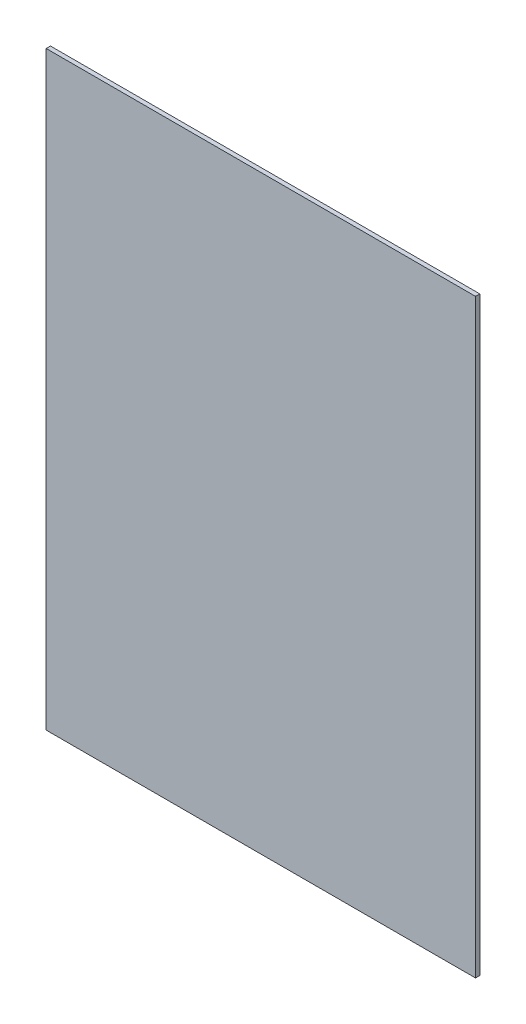
ISO-10303-21;
HEADER;
FILE_DESCRIPTION(('STEP AP214'),'2;1');
FILE_NAME('part.step','',(''),(''),'','','');
FILE_SCHEMA(('AUTOMOTIVE_DESIGN { 1 0 10303 214 1 1 1 1 }'));
ENDSEC;
DATA;
#1=APPLICATION_CONTEXT('core data for automotive mechanical design processes');
#2=APPLICATION_PROTOCOL_DEFINITION('international standard','automotive_design',2000,#1);
#3=PRODUCT_CONTEXT('',#1,'mechanical');
#4=PRODUCT('Part','Part','',(#3));
#5=PRODUCT_RELATED_PRODUCT_CATEGORY('part','',(#4));
#6=PRODUCT_DEFINITION_FORMATION('','',#4);
#7=PRODUCT_DEFINITION_CONTEXT('part definition',#1,'design');
#8=PRODUCT_DEFINITION('design','',#6,#7);
#9=PRODUCT_DEFINITION_SHAPE('','',#8);
#10=(LENGTH_UNIT() NAMED_UNIT(*) SI_UNIT(.MILLI.,.METRE.));
#11=(NAMED_UNIT(*) PLANE_ANGLE_UNIT() SI_UNIT($,.RADIAN.));
#12=(NAMED_UNIT(*) SI_UNIT($,.STERADIAN.) SOLID_ANGLE_UNIT());
#13=UNCERTAINTY_MEASURE_WITH_UNIT(LENGTH_MEASURE(1.E-05),#10,'distance_accuracy_value','');
#14=(GEOMETRIC_REPRESENTATION_CONTEXT(3) GLOBAL_UNCERTAINTY_ASSIGNED_CONTEXT((#13)) GLOBAL_UNIT_ASSIGNED_CONTEXT((#10,
#11,#12)) REPRESENTATION_CONTEXT('',''));
#15=CARTESIAN_POINT('',(0.,0.,0.));
#16=DIRECTION('',(0.,0.,1.));
#17=DIRECTION('',(1.,0.,0.));
#18=AXIS2_PLACEMENT_3D('',#15,#16,#17);
#19=CARTESIAN_POINT('',(200.,275.,4.));
#20=DIRECTION('',(-1.,0.,0.));
#21=DIRECTION('',(0.,-1.,0.));
#22=AXIS2_PLACEMENT_3D('',#19,#20,#21);
#23=PLANE('',#22);
#24=DIRECTION('',(0.,1.,0.));
#25=VECTOR('',#24,1.);
#26=CARTESIAN_POINT('',(200.,275.,0.));
#27=LINE('',#26,#25);
#28=CARTESIAN_POINT('',(200.,-275.,0.));
#29=VERTEX_POINT('',#28);
#30=CARTESIAN_POINT('',(200.,275.,0.));
#31=VERTEX_POINT('',#30);
#32=EDGE_CURVE('E107',#29,#31,#27,.T.);
#33=ORIENTED_EDGE('',*,*,#32,.T.);
#34=DIRECTION('',(0.,0.,-1.));
#35=VECTOR('',#34,1.);
#36=CARTESIAN_POINT('',(200.,275.,4.));
#37=LINE('',#36,#35);
#38=CARTESIAN_POINT('',(200.,275.,4.));
#39=VERTEX_POINT('',#38);
#40=EDGE_CURVE('E11',#39,#31,#37,.T.);
#41=ORIENTED_EDGE('',*,*,#40,.F.);
#42=DIRECTION('',(0.,1.,0.));
#43=VECTOR('',#42,1.);
#44=CARTESIAN_POINT('',(200.,275.,4.));
#45=LINE('',#44,#43);
#46=CARTESIAN_POINT('',(200.,-275.,4.));
#47=VERTEX_POINT('',#46);
#48=EDGE_CURVE('E91',#47,#39,#45,.T.);
#49=ORIENTED_EDGE('',*,*,#48,.F.);
#50=DIRECTION('',(0.,0.,-1.));
#51=VECTOR('',#50,1.);
#52=CARTESIAN_POINT('',(200.,-275.,4.));
#53=LINE('',#52,#51);
#54=EDGE_CURVE('E103',#47,#29,#53,.T.);
#55=ORIENTED_EDGE('',*,*,#54,.T.);
#56=EDGE_LOOP('',(#33,#41,#49,#55));
#57=FACE_BOUND('',#56,.T.);
#58=ADVANCED_FACE('F39',(#57),#23,.F.);
#59=CARTESIAN_POINT('',(-200.,275.,4.));
#60=DIRECTION('',(0.,-1.,0.));
#61=DIRECTION('',(0.,0.,-1.));
#62=AXIS2_PLACEMENT_3D('',#59,#60,#61);
#63=PLANE('',#62);
#64=DIRECTION('',(-1.,0.,0.));
#65=VECTOR('',#64,1.);
#66=CARTESIAN_POINT('',(-200.,275.,0.));
#67=LINE('',#66,#65);
#68=CARTESIAN_POINT('',(-200.,275.,0.));
#69=VERTEX_POINT('',#68);
#70=EDGE_CURVE('E96',#31,#69,#67,.T.);
#71=ORIENTED_EDGE('',*,*,#70,.T.);
#72=DIRECTION('',(0.,0.,-1.));
#73=VECTOR('',#72,1.);
#74=CARTESIAN_POINT('',(-200.,275.,4.));
#75=LINE('',#74,#73);
#76=CARTESIAN_POINT('',(-200.,275.,4.));
#77=VERTEX_POINT('',#76);
#78=EDGE_CURVE('E48',#77,#69,#75,.T.);
#79=ORIENTED_EDGE('',*,*,#78,.F.);
#80=DIRECTION('',(-1.,0.,0.));
#81=VECTOR('',#80,1.);
#82=CARTESIAN_POINT('',(-200.,275.,4.));
#83=LINE('',#82,#81);
#84=EDGE_CURVE('E86',#39,#77,#83,.T.);
#85=ORIENTED_EDGE('',*,*,#84,.F.);
#86=ORIENTED_EDGE('',*,*,#40,.T.);
#87=EDGE_LOOP('',(#71,#79,#85,#86));
#88=FACE_BOUND('',#87,.T.);
#89=ADVANCED_FACE('F95',(#88),#63,.F.);
#90=CARTESIAN_POINT('',(-200.,275.,4.));
#91=DIRECTION('',(1.,0.,0.));
#92=DIRECTION('',(0.,1.,0.));
#93=AXIS2_PLACEMENT_3D('',#90,#91,#92);
#94=PLANE('',#93);
#95=DIRECTION('',(0.,-1.,0.));
#96=VECTOR('',#95,1.);
#97=CARTESIAN_POINT('',(-200.,275.,0.));
#98=LINE('',#97,#96);
#99=CARTESIAN_POINT('',(-200.,-275.,0.));
#100=VERTEX_POINT('',#99);
#101=EDGE_CURVE('E73',#69,#100,#98,.T.);
#102=ORIENTED_EDGE('',*,*,#101,.T.);
#103=DIRECTION('',(0.,0.,-1.));
#104=VECTOR('',#103,1.);
#105=CARTESIAN_POINT('',(-200.,-275.,4.));
#106=LINE('',#105,#104);
#107=CARTESIAN_POINT('',(-200.,-275.,4.));
#108=VERTEX_POINT('',#107);
#109=EDGE_CURVE('E98',#108,#100,#106,.T.);
#110=ORIENTED_EDGE('',*,*,#109,.F.);
#111=DIRECTION('',(0.,-1.,0.));
#112=VECTOR('',#111,1.);
#113=CARTESIAN_POINT('',(-200.,275.,4.));
#114=LINE('',#113,#112);
#115=EDGE_CURVE('E89',#77,#108,#114,.T.);
#116=ORIENTED_EDGE('',*,*,#115,.F.);
#117=ORIENTED_EDGE('',*,*,#78,.T.);
#118=EDGE_LOOP('',(#102,#110,#116,#117));
#119=FACE_BOUND('',#118,.T.);
#120=ADVANCED_FACE('F99',(#119),#94,.F.);
#121=CARTESIAN_POINT('',(-200.,-275.,4.));
#122=DIRECTION('',(0.,1.,0.));
#123=DIRECTION('',(0.,0.,1.));
#124=AXIS2_PLACEMENT_3D('',#121,#122,#123);
#125=PLANE('',#124);
#126=DIRECTION('',(1.,0.,0.));
#127=VECTOR('',#126,1.);
#128=CARTESIAN_POINT('',(-200.,-275.,0.));
#129=LINE('',#128,#127);
#130=EDGE_CURVE('E79',#100,#29,#129,.T.);
#131=ORIENTED_EDGE('',*,*,#130,.T.);
#132=ORIENTED_EDGE('',*,*,#54,.F.);
#133=DIRECTION('',(1.,0.,0.));
#134=VECTOR('',#133,1.);
#135=CARTESIAN_POINT('',(-200.,-275.,4.));
#136=LINE('',#135,#134);
#137=EDGE_CURVE('E56',#108,#47,#136,.T.);
#138=ORIENTED_EDGE('',*,*,#137,.F.);
#139=ORIENTED_EDGE('',*,*,#109,.T.);
#140=EDGE_LOOP('',(#131,#132,#138,#139));
#141=FACE_BOUND('',#140,.T.);
#142=ADVANCED_FACE('F120',(#141),#125,.F.);
#143=CARTESIAN_POINT('',(0.,0.,4.));
#144=DIRECTION('',(0.,0.,1.));
#145=DIRECTION('',(1.,0.,0.));
#146=AXIS2_PLACEMENT_3D('',#143,#144,#145);
#147=PLANE('',#146);
#148=ORIENTED_EDGE('',*,*,#48,.T.);
#149=ORIENTED_EDGE('',*,*,#84,.T.);
#150=ORIENTED_EDGE('',*,*,#115,.T.);
#151=ORIENTED_EDGE('',*,*,#137,.T.);
#152=EDGE_LOOP('',(#148,#149,#150,#151));
#153=FACE_BOUND('',#152,.T.);
#154=ADVANCED_FACE('F87',(#153),#147,.T.);
#155=CARTESIAN_POINT('',(0.,0.,0.));
#156=DIRECTION('',(0.,0.,1.));
#157=DIRECTION('',(1.,0.,0.));
#158=AXIS2_PLACEMENT_3D('',#155,#156,#157);
#159=PLANE('',#158);
#160=ORIENTED_EDGE('',*,*,#32,.F.);
#161=ORIENTED_EDGE('',*,*,#130,.F.);
#162=ORIENTED_EDGE('',*,*,#101,.F.);
#163=ORIENTED_EDGE('',*,*,#70,.F.);
#164=EDGE_LOOP('',(#160,#161,#162,#163));
#165=FACE_BOUND('',#164,.T.);
#166=ADVANCED_FACE('F123',(#165),#159,.F.);
#167=CLOSED_SHELL('',(#58,#89,#120,#142,#154,#166));
#168=MANIFOLD_SOLID_BREP('B2',#167);
#169=ADVANCED_BREP_SHAPE_REPRESENTATION('',(#18,#168),#14);
#170=SHAPE_DEFINITION_REPRESENTATION(#9,#169);
ENDSEC;
END-ISO-10303-21;
